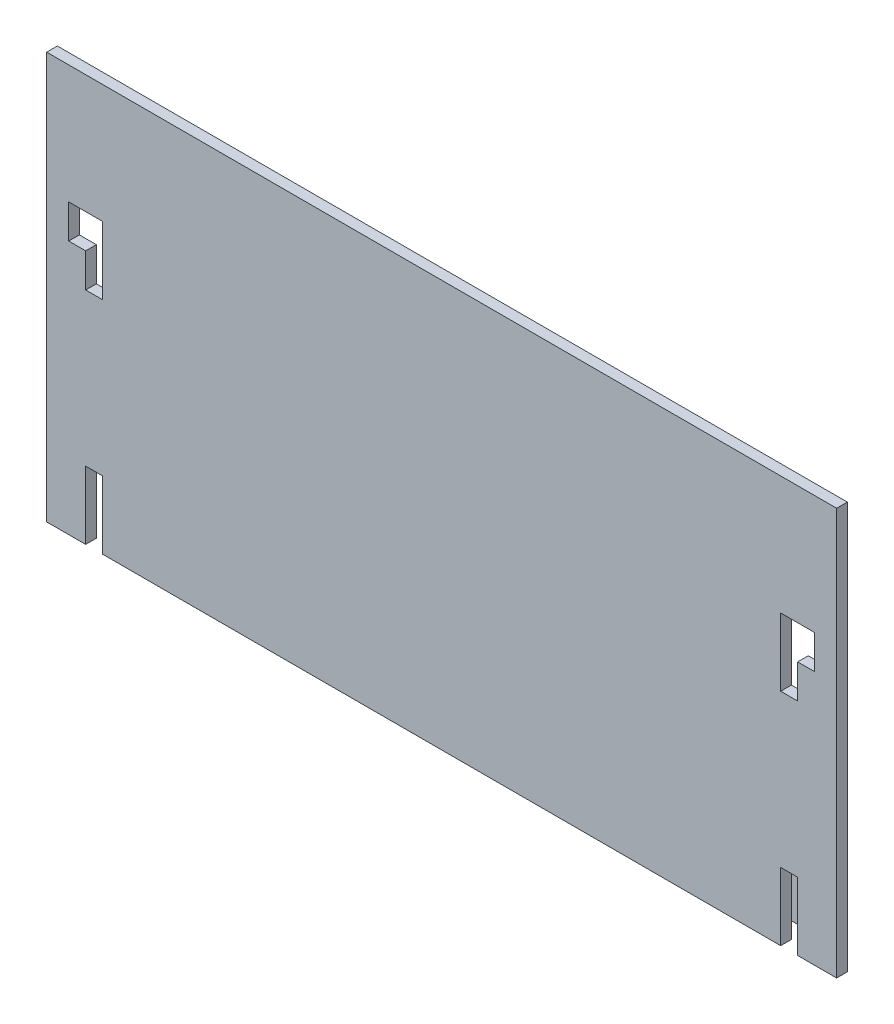
ISO-10303-21;
HEADER;
FILE_DESCRIPTION(('STEP AP214'),'2;1');
FILE_NAME('part.step','',(''),(''),'','','');
FILE_SCHEMA(('AUTOMOTIVE_DESIGN { 1 0 10303 214 1 1 1 1 }'));
ENDSEC;
DATA;
#1=APPLICATION_CONTEXT('core data for automotive mechanical design processes');
#2=APPLICATION_PROTOCOL_DEFINITION('international standard','automotive_design',2000,#1);
#3=PRODUCT_CONTEXT('',#1,'mechanical');
#4=PRODUCT('Part','Part','',(#3));
#5=PRODUCT_RELATED_PRODUCT_CATEGORY('part','',(#4));
#6=PRODUCT_DEFINITION_FORMATION('','',#4);
#7=PRODUCT_DEFINITION_CONTEXT('part definition',#1,'design');
#8=PRODUCT_DEFINITION('design','',#6,#7);
#9=PRODUCT_DEFINITION_SHAPE('','',#8);
#10=(LENGTH_UNIT() NAMED_UNIT(*) SI_UNIT(.MILLI.,.METRE.));
#11=(NAMED_UNIT(*) PLANE_ANGLE_UNIT() SI_UNIT($,.RADIAN.));
#12=(NAMED_UNIT(*) SI_UNIT($,.STERADIAN.) SOLID_ANGLE_UNIT());
#13=UNCERTAINTY_MEASURE_WITH_UNIT(LENGTH_MEASURE(1.E-05),#10,'distance_accuracy_value','');
#14=(GEOMETRIC_REPRESENTATION_CONTEXT(3) GLOBAL_UNCERTAINTY_ASSIGNED_CONTEXT((#13)) GLOBAL_UNIT_ASSIGNED_CONTEXT((#10,
#11,#12)) REPRESENTATION_CONTEXT('',''));
#15=CARTESIAN_POINT('',(0.,0.,0.));
#16=DIRECTION('',(0.,0.,1.));
#17=DIRECTION('',(1.,0.,0.));
#18=AXIS2_PLACEMENT_3D('',#15,#16,#17);
#19=CARTESIAN_POINT('',(147.955,0.,3.524));
#20=DIRECTION('',(0.,0.,1.));
#21=DIRECTION('',(1.,0.,0.));
#22=AXIS2_PLACEMENT_3D('',#19,#20,#21);
#23=PLANE('',#22);
#24=DIRECTION('',(-1.,0.,0.));
#25=VECTOR('',#24,1.);
#26=CARTESIAN_POINT('',(0.,34.925,3.524));
#27=LINE('',#26,#25);
#28=CARTESIAN_POINT('',(7.30249999999999,34.925,3.524));
#29=VERTEX_POINT('',#28);
#30=CARTESIAN_POINT('',(4.12749999999995,34.925,3.524));
#31=VERTEX_POINT('',#30);
#32=EDGE_CURVE('E313',#29,#31,#27,.T.);
#33=ORIENTED_EDGE('',*,*,#32,.T.);
#34=DIRECTION('',(0.,1.,0.));
#35=VECTOR('',#34,1.);
#36=CARTESIAN_POINT('',(4.12749999999995,0.,3.524));
#37=LINE('',#36,#35);
#38=CARTESIAN_POINT('',(4.12749999999995,41.275,3.524));
#39=VERTEX_POINT('',#38);
#40=EDGE_CURVE('E317',#31,#39,#37,.T.);
#41=ORIENTED_EDGE('',*,*,#40,.T.);
#42=DIRECTION('',(-1.,0.,0.));
#43=VECTOR('',#42,1.);
#44=CARTESIAN_POINT('',(0.,41.275,3.524));
#45=LINE('',#44,#43);
#46=CARTESIAN_POINT('',(10.4775,41.275,3.524));
#47=VERTEX_POINT('',#46);
#48=EDGE_CURVE('E322',#47,#39,#45,.T.);
#49=ORIENTED_EDGE('',*,*,#48,.F.);
#50=DIRECTION('',(0.,1.,0.));
#51=VECTOR('',#50,1.);
#52=CARTESIAN_POINT('',(10.4775,0.,3.524));
#53=LINE('',#52,#51);
#54=CARTESIAN_POINT('',(10.4775,28.575,3.524));
#55=VERTEX_POINT('',#54);
#56=EDGE_CURVE('E325',#55,#47,#53,.T.);
#57=ORIENTED_EDGE('',*,*,#56,.F.);
#58=DIRECTION('',(-1.,0.,0.));
#59=VECTOR('',#58,1.);
#60=CARTESIAN_POINT('',(0.,28.575,3.524));
#61=LINE('',#60,#59);
#62=CARTESIAN_POINT('',(7.30249999999999,28.575,3.524));
#63=VERTEX_POINT('',#62);
#64=EDGE_CURVE('E328',#55,#63,#61,.T.);
#65=ORIENTED_EDGE('',*,*,#64,.T.);
#66=DIRECTION('',(0.,-1.,0.));
#67=VECTOR('',#66,1.);
#68=CARTESIAN_POINT('',(7.30249999999999,0.,3.524));
#69=LINE('',#68,#67);
#70=EDGE_CURVE('E332',#29,#63,#69,.T.);
#71=ORIENTED_EDGE('',*,*,#70,.F.);
#72=EDGE_LOOP('',(#33,#41,#49,#57,#65,#71));
#73=FACE_BOUND('',#72,.T.);
#74=DIRECTION('',(0.,1.,0.));
#75=VECTOR('',#74,1.);
#76=CARTESIAN_POINT('',(137.4775,0.,3.524));
#77=LINE('',#76,#75);
#78=CARTESIAN_POINT('',(137.4775,-12.7,3.524));
#79=VERTEX_POINT('',#78);
#80=CARTESIAN_POINT('',(137.4775,0.,3.524));
#81=VERTEX_POINT('',#80);
#82=EDGE_CURVE('E373',#79,#81,#77,.T.);
#83=ORIENTED_EDGE('',*,*,#82,.T.);
#84=DIRECTION('',(1.,0.,0.));
#85=VECTOR('',#84,1.);
#86=CARTESIAN_POINT('',(137.4775,0.,3.524));
#87=LINE('',#86,#85);
#88=CARTESIAN_POINT('',(140.6525,0.,3.524));
#89=VERTEX_POINT('',#88);
#90=EDGE_CURVE('E377',#81,#89,#87,.T.);
#91=ORIENTED_EDGE('',*,*,#90,.T.);
#92=DIRECTION('',(0.,-1.,0.));
#93=VECTOR('',#92,1.);
#94=CARTESIAN_POINT('',(140.6525,0.,3.524));
#95=LINE('',#94,#93);
#96=CARTESIAN_POINT('',(140.6525,-12.7,3.524));
#97=VERTEX_POINT('',#96);
#98=EDGE_CURVE('E382',#89,#97,#95,.T.);
#99=ORIENTED_EDGE('',*,*,#98,.T.);
#100=DIRECTION('',(-1.,0.,0.));
#101=VECTOR('',#100,1.);
#102=CARTESIAN_POINT('',(147.955,-12.7,3.524));
#103=LINE('',#102,#101);
#104=CARTESIAN_POINT('',(147.955,-12.7,3.524));
#105=VERTEX_POINT('',#104);
#106=EDGE_CURVE('E551',#105,#97,#103,.T.);
#107=ORIENTED_EDGE('',*,*,#106,.F.);
#108=DIRECTION('',(0.,1.,0.));
#109=VECTOR('',#108,1.);
#110=CARTESIAN_POINT('',(147.955,0.,3.524));
#111=LINE('',#110,#109);
#112=CARTESIAN_POINT('',(147.955,63.5,3.524));
#113=VERTEX_POINT('',#112);
#114=EDGE_CURVE('E502',#105,#113,#111,.T.);
#115=ORIENTED_EDGE('',*,*,#114,.T.);
#116=DIRECTION('',(-1.,0.,0.));
#117=VECTOR('',#116,1.);
#118=CARTESIAN_POINT('',(147.955,63.5,3.524));
#119=LINE('',#118,#117);
#120=CARTESIAN_POINT('',(0.,63.5,3.524));
#121=VERTEX_POINT('',#120);
#122=EDGE_CURVE('E555',#113,#121,#119,.T.);
#123=ORIENTED_EDGE('',*,*,#122,.T.);
#124=DIRECTION('',(0.,1.,0.));
#125=VECTOR('',#124,1.);
#126=CARTESIAN_POINT('',(0.,0.,3.524));
#127=LINE('',#126,#125);
#128=CARTESIAN_POINT('',(0.,-12.7,3.524));
#129=VERTEX_POINT('',#128);
#130=EDGE_CURVE('E514',#129,#121,#127,.T.);
#131=ORIENTED_EDGE('',*,*,#130,.F.);
#132=CARTESIAN_POINT('',(7.30249999999999,-12.7,3.524));
#133=VERTEX_POINT('',#132);
#134=EDGE_CURVE('E549',#133,#129,#103,.T.);
#135=ORIENTED_EDGE('',*,*,#134,.F.);
#136=DIRECTION('',(0.,1.,0.));
#137=VECTOR('',#136,1.);
#138=CARTESIAN_POINT('',(7.30249999999999,0.,3.524));
#139=LINE('',#138,#137);
#140=CARTESIAN_POINT('',(7.30249999999999,0.,3.524));
#141=VERTEX_POINT('',#140);
#142=EDGE_CURVE('E415',#133,#141,#139,.T.);
#143=ORIENTED_EDGE('',*,*,#142,.T.);
#144=DIRECTION('',(1.,0.,0.));
#145=VECTOR('',#144,1.);
#146=CARTESIAN_POINT('',(10.4775,0.,3.524));
#147=LINE('',#146,#145);
#148=CARTESIAN_POINT('',(10.4775,0.,3.524));
#149=VERTEX_POINT('',#148);
#150=EDGE_CURVE('E420',#141,#149,#147,.T.);
#151=ORIENTED_EDGE('',*,*,#150,.T.);
#152=DIRECTION('',(0.,-1.,0.));
#153=VECTOR('',#152,1.);
#154=CARTESIAN_POINT('',(10.4775,0.,3.524));
#155=LINE('',#154,#153);
#156=CARTESIAN_POINT('',(10.4775,-12.7,3.524));
#157=VERTEX_POINT('',#156);
#158=EDGE_CURVE('E411',#149,#157,#155,.T.);
#159=ORIENTED_EDGE('',*,*,#158,.T.);
#160=EDGE_CURVE('E556',#79,#157,#103,.T.);
#161=ORIENTED_EDGE('',*,*,#160,.F.);
#162=EDGE_LOOP('',(#83,#91,#99,#107,#115,#123,#131,#135,#143,#151,#159,#161));
#163=FACE_BOUND('',#162,.T.);
#164=DIRECTION('',(1.,0.,0.));
#165=VECTOR('',#164,1.);
#166=CARTESIAN_POINT('',(0.,41.275,3.524));
#167=LINE('',#166,#165);
#168=CARTESIAN_POINT('',(137.4775,41.275,3.524));
#169=VERTEX_POINT('',#168);
#170=CARTESIAN_POINT('',(143.8275,41.275,3.524));
#171=VERTEX_POINT('',#170);
#172=EDGE_CURVE('E257',#169,#171,#167,.T.);
#173=ORIENTED_EDGE('',*,*,#172,.T.);
#174=DIRECTION('',(0.,1.,0.));
#175=VECTOR('',#174,1.);
#176=CARTESIAN_POINT('',(143.8275,0.,3.524));
#177=LINE('',#176,#175);
#178=CARTESIAN_POINT('',(143.8275,34.925,3.524));
#179=VERTEX_POINT('',#178);
#180=EDGE_CURVE('E249',#179,#171,#177,.T.);
#181=ORIENTED_EDGE('',*,*,#180,.F.);
#182=DIRECTION('',(1.,0.,0.));
#183=VECTOR('',#182,1.);
#184=CARTESIAN_POINT('',(0.,34.925,3.524));
#185=LINE('',#184,#183);
#186=CARTESIAN_POINT('',(140.6525,34.925,3.524));
#187=VERTEX_POINT('',#186);
#188=EDGE_CURVE('E239',#187,#179,#185,.T.);
#189=ORIENTED_EDGE('',*,*,#188,.F.);
#190=DIRECTION('',(0.,-1.,0.));
#191=VECTOR('',#190,1.);
#192=CARTESIAN_POINT('',(140.6525,0.,3.524));
#193=LINE('',#192,#191);
#194=CARTESIAN_POINT('',(140.6525,28.575,3.524));
#195=VERTEX_POINT('',#194);
#196=EDGE_CURVE('E56',#187,#195,#193,.T.);
#197=ORIENTED_EDGE('',*,*,#196,.T.);
#198=DIRECTION('',(-1.,0.,0.));
#199=VECTOR('',#198,1.);
#200=CARTESIAN_POINT('',(0.,28.575,3.524));
#201=LINE('',#200,#199);
#202=CARTESIAN_POINT('',(137.4775,28.575,3.524));
#203=VERTEX_POINT('',#202);
#204=EDGE_CURVE('E272',#195,#203,#201,.T.);
#205=ORIENTED_EDGE('',*,*,#204,.T.);
#206=DIRECTION('',(0.,1.,0.));
#207=VECTOR('',#206,1.);
#208=CARTESIAN_POINT('',(137.4775,0.,3.524));
#209=LINE('',#208,#207);
#210=EDGE_CURVE('E276',#203,#169,#209,.T.);
#211=ORIENTED_EDGE('',*,*,#210,.T.);
#212=EDGE_LOOP('',(#173,#181,#189,#197,#205,#211));
#213=FACE_BOUND('',#212,.T.);
#214=ADVANCED_FACE('F40',(#73,#163,#213),#23,.T.);
#215=CARTESIAN_POINT('',(147.955,0.,1.524));
#216=DIRECTION('',(0.,0.,-1.));
#217=DIRECTION('',(0.,1.,0.));
#218=AXIS2_PLACEMENT_3D('',#215,#216,#217);
#219=PLANE('',#218);
#220=DIRECTION('',(-1.,0.,0.));
#221=VECTOR('',#220,1.);
#222=CARTESIAN_POINT('',(0.,34.925,1.524));
#223=LINE('',#222,#221);
#224=CARTESIAN_POINT('',(7.30249999999999,34.925,1.524));
#225=VERTEX_POINT('',#224);
#226=CARTESIAN_POINT('',(4.12749999999995,34.925,1.524));
#227=VERTEX_POINT('',#226);
#228=EDGE_CURVE('E336',#225,#227,#223,.T.);
#229=ORIENTED_EDGE('',*,*,#228,.F.);
#230=DIRECTION('',(0.,-1.,0.));
#231=VECTOR('',#230,1.);
#232=CARTESIAN_POINT('',(7.30249999999999,0.,1.524));
#233=LINE('',#232,#231);
#234=CARTESIAN_POINT('',(7.30249999999999,28.575,1.524));
#235=VERTEX_POINT('',#234);
#236=EDGE_CURVE('E318',#225,#235,#233,.T.);
#237=ORIENTED_EDGE('',*,*,#236,.T.);
#238=DIRECTION('',(-1.,0.,0.));
#239=VECTOR('',#238,1.);
#240=CARTESIAN_POINT('',(0.,28.575,1.524));
#241=LINE('',#240,#239);
#242=CARTESIAN_POINT('',(10.4775,28.575,1.524));
#243=VERTEX_POINT('',#242);
#244=EDGE_CURVE('E350',#243,#235,#241,.T.);
#245=ORIENTED_EDGE('',*,*,#244,.F.);
#246=DIRECTION('',(0.,1.,0.));
#247=VECTOR('',#246,1.);
#248=CARTESIAN_POINT('',(10.4775,0.,1.524));
#249=LINE('',#248,#247);
#250=CARTESIAN_POINT('',(10.4775,41.275,1.524));
#251=VERTEX_POINT('',#250);
#252=EDGE_CURVE('E346',#243,#251,#249,.T.);
#253=ORIENTED_EDGE('',*,*,#252,.T.);
#254=DIRECTION('',(-1.,0.,0.));
#255=VECTOR('',#254,1.);
#256=CARTESIAN_POINT('',(0.,41.275,1.524));
#257=LINE('',#256,#255);
#258=CARTESIAN_POINT('',(4.12749999999995,41.275,1.524));
#259=VERTEX_POINT('',#258);
#260=EDGE_CURVE('E342',#251,#259,#257,.T.);
#261=ORIENTED_EDGE('',*,*,#260,.T.);
#262=DIRECTION('',(0.,1.,0.));
#263=VECTOR('',#262,1.);
#264=CARTESIAN_POINT('',(4.12749999999995,0.,1.524));
#265=LINE('',#264,#263);
#266=EDGE_CURVE('E339',#227,#259,#265,.T.);
#267=ORIENTED_EDGE('',*,*,#266,.F.);
#268=EDGE_LOOP('',(#229,#237,#245,#253,#261,#267));
#269=FACE_BOUND('',#268,.T.);
#270=DIRECTION('',(0.,-1.,0.));
#271=VECTOR('',#270,1.);
#272=CARTESIAN_POINT('',(140.6525,0.,1.524));
#273=LINE('',#272,#271);
#274=CARTESIAN_POINT('',(140.6525,0.,1.524));
#275=VERTEX_POINT('',#274);
#276=CARTESIAN_POINT('',(140.6525,-12.7,1.524));
#277=VERTEX_POINT('',#276);
#278=EDGE_CURVE('E378',#275,#277,#273,.T.);
#279=ORIENTED_EDGE('',*,*,#278,.F.);
#280=DIRECTION('',(1.,0.,0.));
#281=VECTOR('',#280,1.);
#282=CARTESIAN_POINT('',(137.4775,0.,1.524));
#283=LINE('',#282,#281);
#284=CARTESIAN_POINT('',(137.4775,0.,1.52399999999999));
#285=VERTEX_POINT('',#284);
#286=EDGE_CURVE('E390',#285,#275,#283,.T.);
#287=ORIENTED_EDGE('',*,*,#286,.F.);
#288=DIRECTION('',(0.,1.,0.));
#289=VECTOR('',#288,1.);
#290=CARTESIAN_POINT('',(137.4775,6.35,1.52399999999999));
#291=LINE('',#290,#289);
#292=CARTESIAN_POINT('',(137.4775,6.35,1.52399999999999));
#293=VERTEX_POINT('',#292);
#294=EDGE_CURVE('E449',#285,#293,#291,.T.);
#295=ORIENTED_EDGE('',*,*,#294,.T.);
#296=DIRECTION('',(-1.,0.,0.));
#297=VECTOR('',#296,1.);
#298=CARTESIAN_POINT('',(147.955,6.35,1.52399999999999));
#299=LINE('',#298,#297);
#300=CARTESIAN_POINT('',(10.4775,6.35,1.52399999999999));
#301=VERTEX_POINT('',#300);
#302=EDGE_CURVE('E49',#293,#301,#299,.T.);
#303=ORIENTED_EDGE('',*,*,#302,.T.);
#304=DIRECTION('',(0.,-1.,0.));
#305=VECTOR('',#304,1.);
#306=CARTESIAN_POINT('',(10.4775,6.35,1.52399999999999));
#307=LINE('',#306,#305);
#308=CARTESIAN_POINT('',(10.4775,0.,1.524));
#309=VERTEX_POINT('',#308);
#310=EDGE_CURVE('E400',#301,#309,#307,.T.);
#311=ORIENTED_EDGE('',*,*,#310,.T.);
#312=DIRECTION('',(1.,0.,0.));
#313=VECTOR('',#312,1.);
#314=CARTESIAN_POINT('',(10.4775,0.,1.524));
#315=LINE('',#314,#313);
#316=CARTESIAN_POINT('',(7.30249999999999,0.,1.524));
#317=VERTEX_POINT('',#316);
#318=EDGE_CURVE('E416',#317,#309,#315,.T.);
#319=ORIENTED_EDGE('',*,*,#318,.F.);
#320=DIRECTION('',(0.,1.,0.));
#321=VECTOR('',#320,1.);
#322=CARTESIAN_POINT('',(7.30249999999999,0.,1.524));
#323=LINE('',#322,#321);
#324=CARTESIAN_POINT('',(7.30249999999999,-12.7,1.524));
#325=VERTEX_POINT('',#324);
#326=EDGE_CURVE('E427',#325,#317,#323,.T.);
#327=ORIENTED_EDGE('',*,*,#326,.F.);
#328=DIRECTION('',(-1.,0.,0.));
#329=VECTOR('',#328,1.);
#330=CARTESIAN_POINT('',(147.955,-12.7,1.524));
#331=LINE('',#330,#329);
#332=CARTESIAN_POINT('',(0.,-12.7,1.524));
#333=VERTEX_POINT('',#332);
#334=EDGE_CURVE('E544',#325,#333,#331,.T.);
#335=ORIENTED_EDGE('',*,*,#334,.T.);
#336=DIRECTION('',(0.,-1.,0.));
#337=VECTOR('',#336,1.);
#338=CARTESIAN_POINT('',(0.,0.,1.524));
#339=LINE('',#338,#337);
#340=CARTESIAN_POINT('',(0.,63.5,1.524));
#341=VERTEX_POINT('',#340);
#342=EDGE_CURVE('E498',#341,#333,#339,.T.);
#343=ORIENTED_EDGE('',*,*,#342,.F.);
#344=DIRECTION('',(-1.,0.,0.));
#345=VECTOR('',#344,1.);
#346=CARTESIAN_POINT('',(147.955,63.5,1.524));
#347=LINE('',#346,#345);
#348=CARTESIAN_POINT('',(147.955,63.5,1.524));
#349=VERTEX_POINT('',#348);
#350=EDGE_CURVE('E559',#349,#341,#347,.T.);
#351=ORIENTED_EDGE('',*,*,#350,.F.);
#352=DIRECTION('',(0.,-1.,0.));
#353=VECTOR('',#352,1.);
#354=CARTESIAN_POINT('',(147.955,0.,1.52399999999999));
#355=LINE('',#354,#353);
#356=CARTESIAN_POINT('',(147.955,-12.7,1.524));
#357=VERTEX_POINT('',#356);
#358=EDGE_CURVE('E494',#349,#357,#355,.T.);
#359=ORIENTED_EDGE('',*,*,#358,.T.);
#360=EDGE_CURVE('E545',#357,#277,#331,.T.);
#361=ORIENTED_EDGE('',*,*,#360,.T.);
#362=EDGE_LOOP('',(#279,#287,#295,#303,#311,#319,#327,#335,#343,#351,#359,#361));
#363=FACE_BOUND('',#362,.T.);
#364=DIRECTION('',(1.,0.,0.));
#365=VECTOR('',#364,1.);
#366=CARTESIAN_POINT('',(0.,34.925,1.524));
#367=LINE('',#366,#365);
#368=CARTESIAN_POINT('',(140.6525,34.925,1.524));
#369=VERTEX_POINT('',#368);
#370=CARTESIAN_POINT('',(143.8275,34.925,1.524));
#371=VERTEX_POINT('',#370);
#372=EDGE_CURVE('E283',#369,#371,#367,.T.);
#373=ORIENTED_EDGE('',*,*,#372,.T.);
#374=DIRECTION('',(0.,1.,0.));
#375=VECTOR('',#374,1.);
#376=CARTESIAN_POINT('',(143.8275,0.,1.524));
#377=LINE('',#376,#375);
#378=CARTESIAN_POINT('',(143.8275,41.275,1.524));
#379=VERTEX_POINT('',#378);
#380=EDGE_CURVE('E255',#371,#379,#377,.T.);
#381=ORIENTED_EDGE('',*,*,#380,.T.);
#382=DIRECTION('',(1.,0.,0.));
#383=VECTOR('',#382,1.);
#384=CARTESIAN_POINT('',(0.,41.275,1.524));
#385=LINE('',#384,#383);
#386=CARTESIAN_POINT('',(137.4775,41.275,1.524));
#387=VERTEX_POINT('',#386);
#388=EDGE_CURVE('E263',#387,#379,#385,.T.);
#389=ORIENTED_EDGE('',*,*,#388,.F.);
#390=DIRECTION('',(0.,1.,0.));
#391=VECTOR('',#390,1.);
#392=CARTESIAN_POINT('',(137.4775,0.,1.524));
#393=LINE('',#392,#391);
#394=CARTESIAN_POINT('',(137.4775,28.575,1.524));
#395=VERTEX_POINT('',#394);
#396=EDGE_CURVE('E267',#395,#387,#393,.T.);
#397=ORIENTED_EDGE('',*,*,#396,.F.);
#398=DIRECTION('',(-1.,0.,0.));
#399=VECTOR('',#398,1.);
#400=CARTESIAN_POINT('',(0.,28.575,1.524));
#401=LINE('',#400,#399);
#402=CARTESIAN_POINT('',(140.6525,28.575,1.524));
#403=VERTEX_POINT('',#402);
#404=EDGE_CURVE('E291',#403,#395,#401,.T.);
#405=ORIENTED_EDGE('',*,*,#404,.F.);
#406=DIRECTION('',(0.,-1.,0.));
#407=VECTOR('',#406,1.);
#408=CARTESIAN_POINT('',(140.6525,0.,1.524));
#409=LINE('',#408,#407);
#410=EDGE_CURVE('E287',#369,#403,#409,.T.);
#411=ORIENTED_EDGE('',*,*,#410,.F.);
#412=EDGE_LOOP('',(#373,#381,#389,#397,#405,#411));
#413=FACE_BOUND('',#412,.T.);
#414=ADVANCED_FACE('F567',(#269,#363,#413),#219,.T.);
#415=CARTESIAN_POINT('',(147.955,-12.7,0.));
#416=DIRECTION('',(0.,-1.,0.));
#417=DIRECTION('',(0.,0.,-1.));
#418=AXIS2_PLACEMENT_3D('',#415,#416,#417);
#419=PLANE('',#418);
#420=DIRECTION('',(0.,0.,-1.));
#421=VECTOR('',#420,1.);
#422=CARTESIAN_POINT('',(137.4775,-12.7,3.524));
#423=LINE('',#422,#421);
#424=CARTESIAN_POINT('',(137.4775,-12.7,1.524));
#425=VERTEX_POINT('',#424);
#426=EDGE_CURVE('E397',#79,#425,#423,.T.);
#427=ORIENTED_EDGE('',*,*,#426,.F.);
#428=ORIENTED_EDGE('',*,*,#160,.T.);
#429=DIRECTION('',(0.,0.,-1.));
#430=VECTOR('',#429,1.);
#431=CARTESIAN_POINT('',(10.4775,-12.7,3.524));
#432=LINE('',#431,#430);
#433=CARTESIAN_POINT('',(10.4775,-12.7,1.524));
#434=VERTEX_POINT('',#433);
#435=EDGE_CURVE('E424',#157,#434,#432,.T.);
#436=ORIENTED_EDGE('',*,*,#435,.T.);
#437=EDGE_CURVE('E550',#425,#434,#331,.T.);
#438=ORIENTED_EDGE('',*,*,#437,.F.);
#439=EDGE_LOOP('',(#427,#428,#436,#438));
#440=FACE_BOUND('',#439,.T.);
#441=ADVANCED_FACE('F611',(#440),#419,.T.);
#442=DIRECTION('',(0.,0.,-1.));
#443=VECTOR('',#442,1.);
#444=CARTESIAN_POINT('',(140.6525,-12.7,3.524));
#445=LINE('',#444,#443);
#446=EDGE_CURVE('E401',#97,#277,#445,.T.);
#447=ORIENTED_EDGE('',*,*,#446,.T.);
#448=ORIENTED_EDGE('',*,*,#360,.F.);
#449=DIRECTION('',(0.,0.,1.));
#450=VECTOR('',#449,1.);
#451=CARTESIAN_POINT('',(147.955,-12.7,0.));
#452=LINE('',#451,#450);
#453=EDGE_CURVE('E506',#357,#105,#452,.T.);
#454=ORIENTED_EDGE('',*,*,#453,.T.);
#455=ORIENTED_EDGE('',*,*,#106,.T.);
#456=EDGE_LOOP('',(#447,#448,#454,#455));
#457=FACE_BOUND('',#456,.T.);
#458=ADVANCED_FACE('F637',(#457),#419,.T.);
#459=DIRECTION('',(0.,1.,0.));
#460=VECTOR('',#459,1.);
#461=CARTESIAN_POINT('',(137.4775,0.,1.524));
#462=LINE('',#461,#460);
#463=EDGE_CURVE('E387',#425,#285,#462,.T.);
#464=ORIENTED_EDGE('',*,*,#463,.F.);
#465=ORIENTED_EDGE('',*,*,#437,.T.);
#466=DIRECTION('',(0.,-1.,0.));
#467=VECTOR('',#466,1.);
#468=CARTESIAN_POINT('',(10.4775,0.,1.524));
#469=LINE('',#468,#467);
#470=EDGE_CURVE('E301',#309,#434,#469,.T.);
#471=ORIENTED_EDGE('',*,*,#470,.F.);
#472=DIRECTION('',(-1.,0.,0.));
#473=VECTOR('',#472,1.);
#474=CARTESIAN_POINT('',(147.955,0.,1.524));
#475=LINE('',#474,#473);
#476=EDGE_CURVE('E540',#285,#309,#475,.T.);
#477=ORIENTED_EDGE('',*,*,#476,.F.);
#478=EDGE_LOOP('',(#464,#465,#471,#477));
#479=FACE_BOUND('',#478,.T.);
#480=ADVANCED_FACE('F602',(#479),#219,.T.);
#481=CARTESIAN_POINT('',(147.955,3.175,0.));
#482=DIRECTION('',(0.,-1.,0.));
#483=DIRECTION('',(0.,0.,-1.));
#484=AXIS2_PLACEMENT_3D('',#481,#482,#483);
#485=PLANE('',#484);
#486=DIRECTION('',(0.,0.,1.));
#487=VECTOR('',#486,1.);
#488=CARTESIAN_POINT('',(137.4775,3.175,0.));
#489=LINE('',#488,#487);
#490=CARTESIAN_POINT('',(137.4775,3.175,-3.52400000000001));
#491=VERTEX_POINT('',#490);
#492=CARTESIAN_POINT('',(137.4775,3.175,-1.65100000000001));
#493=VERTEX_POINT('',#492);
#494=EDGE_CURVE('E490',#491,#493,#489,.T.);
#495=ORIENTED_EDGE('',*,*,#494,.F.);
#496=DIRECTION('',(-1.,0.,0.));
#497=VECTOR('',#496,1.);
#498=CARTESIAN_POINT('',(147.955,3.175,-3.524));
#499=LINE('',#498,#497);
#500=CARTESIAN_POINT('',(10.4775,3.175,-3.52400000000001));
#501=VERTEX_POINT('',#500);
#502=EDGE_CURVE('E510',#491,#501,#499,.T.);
#503=ORIENTED_EDGE('',*,*,#502,.T.);
#504=DIRECTION('',(0.,0.,-1.));
#505=VECTOR('',#504,1.);
#506=CARTESIAN_POINT('',(10.4775,3.175,0.));
#507=LINE('',#506,#505);
#508=CARTESIAN_POINT('',(10.4775,3.175,-1.65100000000001));
#509=VERTEX_POINT('',#508);
#510=EDGE_CURVE('E476',#509,#501,#507,.T.);
#511=ORIENTED_EDGE('',*,*,#510,.F.);
#512=DIRECTION('',(-1.,0.,0.));
#513=VECTOR('',#512,1.);
#514=CARTESIAN_POINT('',(147.955,3.175,-1.65100000000001));
#515=LINE('',#514,#513);
#516=EDGE_CURVE('E11',#493,#509,#515,.T.);
#517=ORIENTED_EDGE('',*,*,#516,.F.);
#518=EDGE_LOOP('',(#495,#503,#511,#517));
#519=FACE_BOUND('',#518,.T.);
#520=ADVANCED_FACE('F42',(#519),#485,.F.);
#521=CARTESIAN_POINT('',(147.955,6.35,-1.65100000000001));
#522=DIRECTION('',(-1.,0.,0.));
#523=DIRECTION('',(0.,0.,1.));
#524=AXIS2_PLACEMENT_3D('',#521,#522,#523);
#525=CYLINDRICAL_SURFACE('',#524,3.175);
#526=CARTESIAN_POINT('',(137.4775,6.35,-1.65100000000001));
#527=DIRECTION('',(1.,0.,0.));
#528=DIRECTION('',(0.,0.,-1.));
#529=AXIS2_PLACEMENT_3D('',#526,#527,#528);
#530=CIRCLE('',#529,3.175);
#531=EDGE_CURVE('E487',#493,#293,#530,.F.);
#532=ORIENTED_EDGE('',*,*,#531,.F.);
#533=ORIENTED_EDGE('',*,*,#516,.T.);
#534=CARTESIAN_POINT('',(10.4775,6.35,-1.65100000000001));
#535=DIRECTION('',(-1.,0.,0.));
#536=DIRECTION('',(0.,-1.,0.));
#537=AXIS2_PLACEMENT_3D('',#534,#535,#536);
#538=CIRCLE('',#537,3.175);
#539=EDGE_CURVE('E473',#301,#509,#538,.F.);
#540=ORIENTED_EDGE('',*,*,#539,.F.);
#541=ORIENTED_EDGE('',*,*,#302,.F.);
#542=EDGE_LOOP('',(#532,#533,#540,#541));
#543=FACE_BOUND('',#542,.T.);
#544=ADVANCED_FACE('F575',(#543),#525,.F.);
#545=CARTESIAN_POINT('',(147.955,0.,0.));
#546=DIRECTION('',(0.,-1.,0.));
#547=DIRECTION('',(0.,0.,-1.));
#548=AXIS2_PLACEMENT_3D('',#545,#546,#547);
#549=PLANE('',#548);
#550=DIRECTION('',(-1.,0.,0.));
#551=VECTOR('',#550,1.);
#552=CARTESIAN_POINT('',(147.955,0.,-1.524));
#553=LINE('',#552,#551);
#554=CARTESIAN_POINT('',(137.4775,0.,-1.524));
#555=VERTEX_POINT('',#554);
#556=CARTESIAN_POINT('',(10.4775,0.,-1.524));
#557=VERTEX_POINT('',#556);
#558=EDGE_CURVE('E536',#555,#557,#553,.T.);
#559=ORIENTED_EDGE('',*,*,#558,.F.);
#560=DIRECTION('',(0.,0.,1.));
#561=VECTOR('',#560,1.);
#562=CARTESIAN_POINT('',(137.4775,0.,0.));
#563=LINE('',#562,#561);
#564=EDGE_CURVE('E483',#555,#285,#563,.T.);
#565=ORIENTED_EDGE('',*,*,#564,.T.);
#566=ORIENTED_EDGE('',*,*,#476,.T.);
#567=DIRECTION('',(0.,0.,-1.));
#568=VECTOR('',#567,1.);
#569=CARTESIAN_POINT('',(10.4775,0.,0.));
#570=LINE('',#569,#568);
#571=EDGE_CURVE('E469',#309,#557,#570,.T.);
#572=ORIENTED_EDGE('',*,*,#571,.T.);
#573=EDGE_LOOP('',(#559,#565,#566,#572));
#574=FACE_BOUND('',#573,.T.);
#575=ADVANCED_FACE('F597',(#574),#549,.T.);
#576=CARTESIAN_POINT('',(147.955,0.,-1.524));
#577=DIRECTION('',(0.,0.,1.));
#578=DIRECTION('',(0.,-1.,0.));
#579=AXIS2_PLACEMENT_3D('',#576,#577,#578);
#580=PLANE('',#579);
#581=DIRECTION('',(-1.,0.,0.));
#582=VECTOR('',#581,1.);
#583=CARTESIAN_POINT('',(147.955,-12.7,-1.52400000000001));
#584=LINE('',#583,#582);
#585=CARTESIAN_POINT('',(137.4775,-12.7,-1.52400000000001));
#586=VERTEX_POINT('',#585);
#587=CARTESIAN_POINT('',(10.4775,-12.7,-1.52400000000001));
#588=VERTEX_POINT('',#587);
#589=EDGE_CURVE('E532',#586,#588,#584,.T.);
#590=ORIENTED_EDGE('',*,*,#589,.F.);
#591=DIRECTION('',(0.,1.,0.));
#592=VECTOR('',#591,1.);
#593=CARTESIAN_POINT('',(137.4775,0.,-1.524));
#594=LINE('',#593,#592);
#595=EDGE_CURVE('E479',#586,#555,#594,.T.);
#596=ORIENTED_EDGE('',*,*,#595,.T.);
#597=ORIENTED_EDGE('',*,*,#558,.T.);
#598=DIRECTION('',(0.,-1.,0.));
#599=VECTOR('',#598,1.);
#600=CARTESIAN_POINT('',(10.4775,0.,-1.524));
#601=LINE('',#600,#599);
#602=EDGE_CURVE('E457',#557,#588,#601,.T.);
#603=ORIENTED_EDGE('',*,*,#602,.T.);
#604=EDGE_LOOP('',(#590,#596,#597,#603));
#605=FACE_BOUND('',#604,.T.);
#606=ADVANCED_FACE('F594',(#605),#580,.T.);
#607=CARTESIAN_POINT('',(147.955,-12.7,0.));
#608=DIRECTION('',(0.,-1.,0.));
#609=DIRECTION('',(0.,0.,-1.));
#610=AXIS2_PLACEMENT_3D('',#607,#608,#609);
#611=PLANE('',#610);
#612=DIRECTION('',(-1.,0.,0.));
#613=VECTOR('',#612,1.);
#614=CARTESIAN_POINT('',(147.955,-12.7,-3.52400000000001));
#615=LINE('',#614,#613);
#616=CARTESIAN_POINT('',(137.4775,-12.7,-3.52400000000002));
#617=VERTEX_POINT('',#616);
#618=CARTESIAN_POINT('',(10.4775,-12.7,-3.52400000000002));
#619=VERTEX_POINT('',#618);
#620=EDGE_CURVE('E528',#617,#619,#615,.T.);
#621=ORIENTED_EDGE('',*,*,#620,.F.);
#622=DIRECTION('',(0.,0.,1.));
#623=VECTOR('',#622,1.);
#624=CARTESIAN_POINT('',(137.4775,-12.7,-3.52400000000002));
#625=LINE('',#624,#623);
#626=EDGE_CURVE('E448',#617,#586,#625,.T.);
#627=ORIENTED_EDGE('',*,*,#626,.T.);
#628=ORIENTED_EDGE('',*,*,#589,.T.);
#629=DIRECTION('',(0.,0.,1.));
#630=VECTOR('',#629,1.);
#631=CARTESIAN_POINT('',(10.4775,-12.7,-3.52400000000002));
#632=LINE('',#631,#630);
#633=EDGE_CURVE('E453',#619,#588,#632,.T.);
#634=ORIENTED_EDGE('',*,*,#633,.F.);
#635=EDGE_LOOP('',(#621,#627,#628,#634));
#636=FACE_BOUND('',#635,.T.);
#637=ADVANCED_FACE('F591',(#636),#611,.T.);
#638=CARTESIAN_POINT('',(147.955,0.,-3.524));
#639=DIRECTION('',(0.,0.,-1.));
#640=DIRECTION('',(0.,1.,0.));
#641=AXIS2_PLACEMENT_3D('',#638,#639,#640);
#642=PLANE('',#641);
#643=ORIENTED_EDGE('',*,*,#502,.F.);
#644=DIRECTION('',(0.,1.,0.));
#645=VECTOR('',#644,1.);
#646=CARTESIAN_POINT('',(137.4775,6.35000000000001,-3.52400000000001));
#647=LINE('',#646,#645);
#648=EDGE_CURVE('E445',#617,#491,#647,.T.);
#649=ORIENTED_EDGE('',*,*,#648,.F.);
#650=ORIENTED_EDGE('',*,*,#620,.T.);
#651=DIRECTION('',(0.,-1.,0.));
#652=VECTOR('',#651,1.);
#653=CARTESIAN_POINT('',(10.4775,6.35,-3.52400000000001));
#654=LINE('',#653,#652);
#655=EDGE_CURVE('E458',#501,#619,#654,.T.);
#656=ORIENTED_EDGE('',*,*,#655,.F.);
#657=EDGE_LOOP('',(#643,#649,#650,#656));
#658=FACE_BOUND('',#657,.T.);
#659=ADVANCED_FACE('F587',(#658),#642,.T.);
#660=CARTESIAN_POINT('',(147.955,0.,0.));
#661=DIRECTION('',(1.,0.,0.));
#662=DIRECTION('',(0.,0.,-1.));
#663=AXIS2_PLACEMENT_3D('',#660,#661,#662);
#664=PLANE('',#663);
#665=ORIENTED_EDGE('',*,*,#453,.F.);
#666=ORIENTED_EDGE('',*,*,#358,.F.);
#667=DIRECTION('',(0.,0.,-1.));
#668=VECTOR('',#667,1.);
#669=CARTESIAN_POINT('',(147.955,63.5,0.));
#670=LINE('',#669,#668);
#671=EDGE_CURVE('E497',#113,#349,#670,.T.);
#672=ORIENTED_EDGE('',*,*,#671,.F.);
#673=ORIENTED_EDGE('',*,*,#114,.F.);
#674=EDGE_LOOP('',(#665,#666,#672,#673));
#675=FACE_BOUND('',#674,.T.);
#676=ADVANCED_FACE('F634',(#675),#664,.T.);
#677=CARTESIAN_POINT('',(147.955,63.5,0.));
#678=DIRECTION('',(0.,1.,0.));
#679=DIRECTION('',(0.,0.,1.));
#680=AXIS2_PLACEMENT_3D('',#677,#678,#679);
#681=PLANE('',#680);
#682=DIRECTION('',(0.,0.,-1.));
#683=VECTOR('',#682,1.);
#684=CARTESIAN_POINT('',(0.,63.5,0.));
#685=LINE('',#684,#683);
#686=EDGE_CURVE('E493',#121,#341,#685,.T.);
#687=ORIENTED_EDGE('',*,*,#686,.F.);
#688=ORIENTED_EDGE('',*,*,#122,.F.);
#689=ORIENTED_EDGE('',*,*,#671,.T.);
#690=ORIENTED_EDGE('',*,*,#350,.T.);
#691=EDGE_LOOP('',(#687,#688,#689,#690));
#692=FACE_BOUND('',#691,.T.);
#693=ADVANCED_FACE('F629',(#692),#681,.T.);
#694=DIRECTION('',(0.,0.,-1.));
#695=VECTOR('',#694,1.);
#696=CARTESIAN_POINT('',(7.30249999999999,-12.7,3.524));
#697=LINE('',#696,#695);
#698=EDGE_CURVE('E439',#133,#325,#697,.T.);
#699=ORIENTED_EDGE('',*,*,#698,.F.);
#700=ORIENTED_EDGE('',*,*,#134,.T.);
#701=DIRECTION('',(0.,0.,1.));
#702=VECTOR('',#701,1.);
#703=CARTESIAN_POINT('',(0.,-12.7,0.));
#704=LINE('',#703,#702);
#705=EDGE_CURVE('E518',#333,#129,#704,.T.);
#706=ORIENTED_EDGE('',*,*,#705,.F.);
#707=ORIENTED_EDGE('',*,*,#334,.F.);
#708=EDGE_LOOP('',(#699,#700,#706,#707));
#709=FACE_BOUND('',#708,.T.);
#710=ADVANCED_FACE('F621',(#709),#419,.T.);
#711=CARTESIAN_POINT('',(0.,0.,0.));
#712=DIRECTION('',(1.,0.,0.));
#713=DIRECTION('',(0.,0.,-1.));
#714=AXIS2_PLACEMENT_3D('',#711,#712,#713);
#715=PLANE('',#714);
#716=ORIENTED_EDGE('',*,*,#686,.T.);
#717=ORIENTED_EDGE('',*,*,#342,.T.);
#718=ORIENTED_EDGE('',*,*,#705,.T.);
#719=ORIENTED_EDGE('',*,*,#130,.T.);
#720=EDGE_LOOP('',(#716,#717,#718,#719));
#721=FACE_BOUND('',#720,.T.);
#722=ADVANCED_FACE('F625',(#721),#715,.F.);
#723=CARTESIAN_POINT('',(10.4775,6.35,-3.52400000000001));
#724=DIRECTION('',(-1.,0.,0.));
#725=DIRECTION('',(0.,-1.,0.));
#726=AXIS2_PLACEMENT_3D('',#723,#724,#725);
#727=PLANE('',#726);
#728=ORIENTED_EDGE('',*,*,#510,.T.);
#729=ORIENTED_EDGE('',*,*,#655,.T.);
#730=ORIENTED_EDGE('',*,*,#633,.T.);
#731=ORIENTED_EDGE('',*,*,#602,.F.);
#732=ORIENTED_EDGE('',*,*,#571,.F.);
#733=ORIENTED_EDGE('',*,*,#310,.F.);
#734=ORIENTED_EDGE('',*,*,#539,.T.);
#735=EDGE_LOOP('',(#728,#729,#730,#731,#732,#733,#734));
#736=FACE_BOUND('',#735,.T.);
#737=ADVANCED_FACE('F579',(#736),#727,.T.);
#738=CARTESIAN_POINT('',(137.4775,6.35000000000001,-3.52400000000001));
#739=DIRECTION('',(1.,0.,0.));
#740=DIRECTION('',(0.,0.,-1.));
#741=AXIS2_PLACEMENT_3D('',#738,#739,#740);
#742=PLANE('',#741);
#743=ORIENTED_EDGE('',*,*,#494,.T.);
#744=ORIENTED_EDGE('',*,*,#531,.T.);
#745=ORIENTED_EDGE('',*,*,#294,.F.);
#746=ORIENTED_EDGE('',*,*,#564,.F.);
#747=ORIENTED_EDGE('',*,*,#595,.F.);
#748=ORIENTED_EDGE('',*,*,#626,.F.);
#749=ORIENTED_EDGE('',*,*,#648,.T.);
#750=EDGE_LOOP('',(#743,#744,#745,#746,#747,#748,#749));
#751=FACE_BOUND('',#750,.T.);
#752=ADVANCED_FACE('F697',(#751),#742,.T.);
#753=CARTESIAN_POINT('',(10.4775,0.,3.524));
#754=DIRECTION('',(1.,0.,0.));
#755=DIRECTION('',(0.,1.,0.));
#756=AXIS2_PLACEMENT_3D('',#753,#754,#755);
#757=PLANE('',#756);
#758=ORIENTED_EDGE('',*,*,#470,.T.);
#759=ORIENTED_EDGE('',*,*,#435,.F.);
#760=ORIENTED_EDGE('',*,*,#158,.F.);
#761=DIRECTION('',(0.,0.,-1.));
#762=VECTOR('',#761,1.);
#763=CARTESIAN_POINT('',(10.4775,0.,3.524));
#764=LINE('',#763,#762);
#765=EDGE_CURVE('E391',#149,#309,#764,.T.);
#766=ORIENTED_EDGE('',*,*,#765,.T.);
#767=EDGE_LOOP('',(#758,#759,#760,#766));
#768=FACE_BOUND('',#767,.T.);
#769=ADVANCED_FACE('F606',(#768),#757,.F.);
#770=CARTESIAN_POINT('',(10.4775,0.,3.524));
#771=DIRECTION('',(0.,1.,0.));
#772=DIRECTION('',(0.,0.,1.));
#773=AXIS2_PLACEMENT_3D('',#770,#771,#772);
#774=PLANE('',#773);
#775=ORIENTED_EDGE('',*,*,#318,.T.);
#776=ORIENTED_EDGE('',*,*,#765,.F.);
#777=ORIENTED_EDGE('',*,*,#150,.F.);
#778=DIRECTION('',(0.,0.,-1.));
#779=VECTOR('',#778,1.);
#780=CARTESIAN_POINT('',(7.30249999999999,0.,3.524));
#781=LINE('',#780,#779);
#782=EDGE_CURVE('E436',#141,#317,#781,.T.);
#783=ORIENTED_EDGE('',*,*,#782,.T.);
#784=EDGE_LOOP('',(#775,#776,#777,#783));
#785=FACE_BOUND('',#784,.T.);
#786=ADVANCED_FACE('F654',(#785),#774,.F.);
#787=CARTESIAN_POINT('',(7.30249999999999,0.,3.524));
#788=DIRECTION('',(-1.,0.,0.));
#789=DIRECTION('',(0.,-1.,0.));
#790=AXIS2_PLACEMENT_3D('',#787,#788,#789);
#791=PLANE('',#790);
#792=ORIENTED_EDGE('',*,*,#326,.T.);
#793=ORIENTED_EDGE('',*,*,#782,.F.);
#794=ORIENTED_EDGE('',*,*,#142,.F.);
#795=ORIENTED_EDGE('',*,*,#698,.T.);
#796=EDGE_LOOP('',(#792,#793,#794,#795));
#797=FACE_BOUND('',#796,.T.);
#798=ADVANCED_FACE('F647',(#797),#791,.F.);
#799=CARTESIAN_POINT('',(137.4775,0.,3.524));
#800=DIRECTION('',(-1.,0.,0.));
#801=DIRECTION('',(0.,0.,1.));
#802=AXIS2_PLACEMENT_3D('',#799,#800,#801);
#803=PLANE('',#802);
#804=ORIENTED_EDGE('',*,*,#463,.T.);
#805=DIRECTION('',(0.,0.,-1.));
#806=VECTOR('',#805,1.);
#807=CARTESIAN_POINT('',(137.4775,0.,3.524));
#808=LINE('',#807,#806);
#809=EDGE_CURVE('E386',#81,#285,#808,.T.);
#810=ORIENTED_EDGE('',*,*,#809,.F.);
#811=ORIENTED_EDGE('',*,*,#82,.F.);
#812=ORIENTED_EDGE('',*,*,#426,.T.);
#813=EDGE_LOOP('',(#804,#810,#811,#812));
#814=FACE_BOUND('',#813,.T.);
#815=ADVANCED_FACE('F645',(#814),#803,.F.);
#816=CARTESIAN_POINT('',(140.6525,0.,3.524));
#817=DIRECTION('',(1.,0.,0.));
#818=DIRECTION('',(0.,0.,-1.));
#819=AXIS2_PLACEMENT_3D('',#816,#817,#818);
#820=PLANE('',#819);
#821=ORIENTED_EDGE('',*,*,#278,.T.);
#822=ORIENTED_EDGE('',*,*,#446,.F.);
#823=ORIENTED_EDGE('',*,*,#98,.F.);
#824=DIRECTION('',(0.,0.,-1.));
#825=VECTOR('',#824,1.);
#826=CARTESIAN_POINT('',(140.6525,0.,3.524));
#827=LINE('',#826,#825);
#828=EDGE_CURVE('E405',#89,#275,#827,.T.);
#829=ORIENTED_EDGE('',*,*,#828,.T.);
#830=EDGE_LOOP('',(#821,#822,#823,#829));
#831=FACE_BOUND('',#830,.T.);
#832=ADVANCED_FACE('F640',(#831),#820,.F.);
#833=CARTESIAN_POINT('',(137.4775,0.,3.524));
#834=DIRECTION('',(0.,1.,0.));
#835=DIRECTION('',(-1.,0.,0.));
#836=AXIS2_PLACEMENT_3D('',#833,#834,#835);
#837=PLANE('',#836);
#838=ORIENTED_EDGE('',*,*,#286,.T.);
#839=ORIENTED_EDGE('',*,*,#828,.F.);
#840=ORIENTED_EDGE('',*,*,#90,.F.);
#841=ORIENTED_EDGE('',*,*,#809,.T.);
#842=EDGE_LOOP('',(#838,#839,#840,#841));
#843=FACE_BOUND('',#842,.T.);
#844=ADVANCED_FACE('F643',(#843),#837,.F.);
#845=CARTESIAN_POINT('',(0.,34.925,3.524));
#846=DIRECTION('',(0.,-1.,0.));
#847=DIRECTION('',(1.,0.,0.));
#848=AXIS2_PLACEMENT_3D('',#845,#846,#847);
#849=PLANE('',#848);
#850=ORIENTED_EDGE('',*,*,#228,.T.);
#851=DIRECTION('',(0.,0.,-1.));
#852=VECTOR('',#851,1.);
#853=CARTESIAN_POINT('',(4.12749999999995,34.925,3.524));
#854=LINE('',#853,#852);
#855=EDGE_CURVE('E335',#31,#227,#854,.T.);
#856=ORIENTED_EDGE('',*,*,#855,.F.);
#857=ORIENTED_EDGE('',*,*,#32,.F.);
#858=DIRECTION('',(0.,0.,-1.));
#859=VECTOR('',#858,1.);
#860=CARTESIAN_POINT('',(7.30249999999999,34.925,3.524));
#861=LINE('',#860,#859);
#862=EDGE_CURVE('E284',#29,#225,#861,.T.);
#863=ORIENTED_EDGE('',*,*,#862,.T.);
#864=EDGE_LOOP('',(#850,#856,#857,#863));
#865=FACE_BOUND('',#864,.T.);
#866=ADVANCED_FACE('F733',(#865),#849,.F.);
#867=CARTESIAN_POINT('',(7.30249999999999,0.,3.524));
#868=DIRECTION('',(1.,0.,0.));
#869=DIRECTION('',(0.,0.,-1.));
#870=AXIS2_PLACEMENT_3D('',#867,#868,#869);
#871=PLANE('',#870);
#872=ORIENTED_EDGE('',*,*,#236,.F.);
#873=ORIENTED_EDGE('',*,*,#862,.F.);
#874=ORIENTED_EDGE('',*,*,#70,.T.);
#875=DIRECTION('',(0.,0.,-1.));
#876=VECTOR('',#875,1.);
#877=CARTESIAN_POINT('',(7.30249999999999,28.575,3.524));
#878=LINE('',#877,#876);
#879=EDGE_CURVE('E359',#63,#235,#878,.T.);
#880=ORIENTED_EDGE('',*,*,#879,.T.);
#881=EDGE_LOOP('',(#872,#873,#874,#880));
#882=FACE_BOUND('',#881,.T.);
#883=ADVANCED_FACE('F753',(#882),#871,.T.);
#884=CARTESIAN_POINT('',(0.,28.575,3.524));
#885=DIRECTION('',(0.,-1.,0.));
#886=DIRECTION('',(0.,0.,-1.));
#887=AXIS2_PLACEMENT_3D('',#884,#885,#886);
#888=PLANE('',#887);
#889=ORIENTED_EDGE('',*,*,#244,.T.);
#890=ORIENTED_EDGE('',*,*,#879,.F.);
#891=ORIENTED_EDGE('',*,*,#64,.F.);
#892=DIRECTION('',(0.,0.,-1.));
#893=VECTOR('',#892,1.);
#894=CARTESIAN_POINT('',(10.4775,28.575,3.524));
#895=LINE('',#894,#893);
#896=EDGE_CURVE('E362',#55,#243,#895,.T.);
#897=ORIENTED_EDGE('',*,*,#896,.T.);
#898=EDGE_LOOP('',(#889,#890,#891,#897));
#899=FACE_BOUND('',#898,.T.);
#900=ADVANCED_FACE('F761',(#899),#888,.F.);
#901=CARTESIAN_POINT('',(10.4775,0.,3.524));
#902=DIRECTION('',(-1.,0.,0.));
#903=DIRECTION('',(0.,0.,1.));
#904=AXIS2_PLACEMENT_3D('',#901,#902,#903);
#905=PLANE('',#904);
#906=ORIENTED_EDGE('',*,*,#252,.F.);
#907=ORIENTED_EDGE('',*,*,#896,.F.);
#908=ORIENTED_EDGE('',*,*,#56,.T.);
#909=DIRECTION('',(0.,0.,-1.));
#910=VECTOR('',#909,1.);
#911=CARTESIAN_POINT('',(10.4775,41.275,3.524));
#912=LINE('',#911,#910);
#913=EDGE_CURVE('E365',#47,#251,#912,.T.);
#914=ORIENTED_EDGE('',*,*,#913,.T.);
#915=EDGE_LOOP('',(#906,#907,#908,#914));
#916=FACE_BOUND('',#915,.T.);
#917=ADVANCED_FACE('F769',(#916),#905,.T.);
#918=CARTESIAN_POINT('',(0.,41.275,3.524));
#919=DIRECTION('',(0.,-1.,0.));
#920=DIRECTION('',(0.,0.,-1.));
#921=AXIS2_PLACEMENT_3D('',#918,#919,#920);
#922=PLANE('',#921);
#923=ORIENTED_EDGE('',*,*,#260,.F.);
#924=ORIENTED_EDGE('',*,*,#913,.F.);
#925=ORIENTED_EDGE('',*,*,#48,.T.);
#926=DIRECTION('',(0.,0.,-1.));
#927=VECTOR('',#926,1.);
#928=CARTESIAN_POINT('',(4.12749999999995,41.275,3.524));
#929=LINE('',#928,#927);
#930=EDGE_CURVE('E64',#39,#259,#929,.T.);
#931=ORIENTED_EDGE('',*,*,#930,.T.);
#932=EDGE_LOOP('',(#923,#924,#925,#931));
#933=FACE_BOUND('',#932,.T.);
#934=ADVANCED_FACE('F777',(#933),#922,.T.);
#935=CARTESIAN_POINT('',(4.12749999999995,0.,3.524));
#936=DIRECTION('',(-1.,0.,0.));
#937=DIRECTION('',(0.,0.,1.));
#938=AXIS2_PLACEMENT_3D('',#935,#936,#937);
#939=PLANE('',#938);
#940=ORIENTED_EDGE('',*,*,#266,.T.);
#941=ORIENTED_EDGE('',*,*,#930,.F.);
#942=ORIENTED_EDGE('',*,*,#40,.F.);
#943=ORIENTED_EDGE('',*,*,#855,.T.);
#944=EDGE_LOOP('',(#940,#941,#942,#943));
#945=FACE_BOUND('',#944,.T.);
#946=ADVANCED_FACE('F785',(#945),#939,.F.);
#947=CARTESIAN_POINT('',(143.8275,0.,3.524));
#948=DIRECTION('',(-1.,0.,0.));
#949=DIRECTION('',(0.,0.,1.));
#950=AXIS2_PLACEMENT_3D('',#947,#948,#949);
#951=PLANE('',#950);
#952=ORIENTED_EDGE('',*,*,#380,.F.);
#953=DIRECTION('',(0.,0.,-1.));
#954=VECTOR('',#953,1.);
#955=CARTESIAN_POINT('',(143.8275,34.925,3.524));
#956=LINE('',#955,#954);
#957=EDGE_CURVE('E243',#179,#371,#956,.T.);
#958=ORIENTED_EDGE('',*,*,#957,.F.);
#959=ORIENTED_EDGE('',*,*,#180,.T.);
#960=DIRECTION('',(0.,0.,-1.));
#961=VECTOR('',#960,1.);
#962=CARTESIAN_POINT('',(143.8275,41.275,3.524));
#963=LINE('',#962,#961);
#964=EDGE_CURVE('E298',#171,#379,#963,.T.);
#965=ORIENTED_EDGE('',*,*,#964,.T.);
#966=EDGE_LOOP('',(#952,#958,#959,#965));
#967=FACE_BOUND('',#966,.T.);
#968=ADVANCED_FACE('F252',(#967),#951,.T.);
#969=CARTESIAN_POINT('',(0.,41.275,3.524));
#970=DIRECTION('',(0.,1.,0.));
#971=DIRECTION('',(0.,0.,1.));
#972=AXIS2_PLACEMENT_3D('',#969,#970,#971);
#973=PLANE('',#972);
#974=ORIENTED_EDGE('',*,*,#388,.T.);
#975=ORIENTED_EDGE('',*,*,#964,.F.);
#976=ORIENTED_EDGE('',*,*,#172,.F.);
#977=DIRECTION('',(0.,0.,-1.));
#978=VECTOR('',#977,1.);
#979=CARTESIAN_POINT('',(137.4775,41.275,3.524));
#980=LINE('',#979,#978);
#981=EDGE_CURVE('E302',#169,#387,#980,.T.);
#982=ORIENTED_EDGE('',*,*,#981,.T.);
#983=EDGE_LOOP('',(#974,#975,#976,#982));
#984=FACE_BOUND('',#983,.T.);
#985=ADVANCED_FACE('F799',(#984),#973,.F.);
#986=CARTESIAN_POINT('',(137.4775,0.,3.524));
#987=DIRECTION('',(-1.,0.,0.));
#988=DIRECTION('',(0.,0.,1.));
#989=AXIS2_PLACEMENT_3D('',#986,#987,#988);
#990=PLANE('',#989);
#991=ORIENTED_EDGE('',*,*,#396,.T.);
#992=ORIENTED_EDGE('',*,*,#981,.F.);
#993=ORIENTED_EDGE('',*,*,#210,.F.);
#994=DIRECTION('',(0.,0.,-1.));
#995=VECTOR('',#994,1.);
#996=CARTESIAN_POINT('',(137.4775,28.575,3.524));
#997=LINE('',#996,#995);
#998=EDGE_CURVE('E305',#203,#395,#997,.T.);
#999=ORIENTED_EDGE('',*,*,#998,.T.);
#1000=EDGE_LOOP('',(#991,#992,#993,#999));
#1001=FACE_BOUND('',#1000,.T.);
#1002=ADVANCED_FACE('F806',(#1001),#990,.F.);
#1003=CARTESIAN_POINT('',(0.,28.575,3.524));
#1004=DIRECTION('',(0.,-1.,0.));
#1005=DIRECTION('',(0.,0.,-1.));
#1006=AXIS2_PLACEMENT_3D('',#1003,#1004,#1005);
#1007=PLANE('',#1006);
#1008=ORIENTED_EDGE('',*,*,#404,.T.);
#1009=ORIENTED_EDGE('',*,*,#998,.F.);
#1010=ORIENTED_EDGE('',*,*,#204,.F.);
#1011=DIRECTION('',(0.,0.,-1.));
#1012=VECTOR('',#1011,1.);
#1013=CARTESIAN_POINT('',(140.6525,28.575,3.524));
#1014=LINE('',#1013,#1012);
#1015=EDGE_CURVE('E308',#195,#403,#1014,.T.);
#1016=ORIENTED_EDGE('',*,*,#1015,.T.);
#1017=EDGE_LOOP('',(#1008,#1009,#1010,#1016));
#1018=FACE_BOUND('',#1017,.T.);
#1019=ADVANCED_FACE('F814',(#1018),#1007,.F.);
#1020=CARTESIAN_POINT('',(140.6525,0.,3.524));
#1021=DIRECTION('',(1.,0.,0.));
#1022=DIRECTION('',(0.,0.,-1.));
#1023=AXIS2_PLACEMENT_3D('',#1020,#1021,#1022);
#1024=PLANE('',#1023);
#1025=ORIENTED_EDGE('',*,*,#410,.T.);
#1026=ORIENTED_EDGE('',*,*,#1015,.F.);
#1027=ORIENTED_EDGE('',*,*,#196,.F.);
#1028=DIRECTION('',(0.,0.,-1.));
#1029=VECTOR('',#1028,1.);
#1030=CARTESIAN_POINT('',(140.6525,34.925,3.524));
#1031=LINE('',#1030,#1029);
#1032=EDGE_CURVE('E245',#187,#369,#1031,.T.);
#1033=ORIENTED_EDGE('',*,*,#1032,.T.);
#1034=EDGE_LOOP('',(#1025,#1026,#1027,#1033));
#1035=FACE_BOUND('',#1034,.T.);
#1036=ADVANCED_FACE('F822',(#1035),#1024,.F.);
#1037=CARTESIAN_POINT('',(0.,34.925,3.524));
#1038=DIRECTION('',(0.,1.,0.));
#1039=DIRECTION('',(0.,0.,1.));
#1040=AXIS2_PLACEMENT_3D('',#1037,#1038,#1039);
#1041=PLANE('',#1040);
#1042=ORIENTED_EDGE('',*,*,#372,.F.);
#1043=ORIENTED_EDGE('',*,*,#1032,.F.);
#1044=ORIENTED_EDGE('',*,*,#188,.T.);
#1045=ORIENTED_EDGE('',*,*,#957,.T.);
#1046=EDGE_LOOP('',(#1042,#1043,#1044,#1045));
#1047=FACE_BOUND('',#1046,.T.);
#1048=ADVANCED_FACE('F242',(#1047),#1041,.T.);
#1049=CLOSED_SHELL('',(#214,#414,#441,#458,#480,#520,#544,#575,#606,#637,#659,#676,#693,#710,
#722,#737,#752,#769,#786,#798,#815,#832,#844,#866,#883,#900,#917,#934,#946,#968,#985,#1002,
#1019,#1036,#1048));
#1050=MANIFOLD_SOLID_BREP('B2',#1049);
#1051=ADVANCED_BREP_SHAPE_REPRESENTATION('',(#18,#1050),#14);
#1052=SHAPE_DEFINITION_REPRESENTATION(#9,#1051);
ENDSEC;
END-ISO-10303-21;
